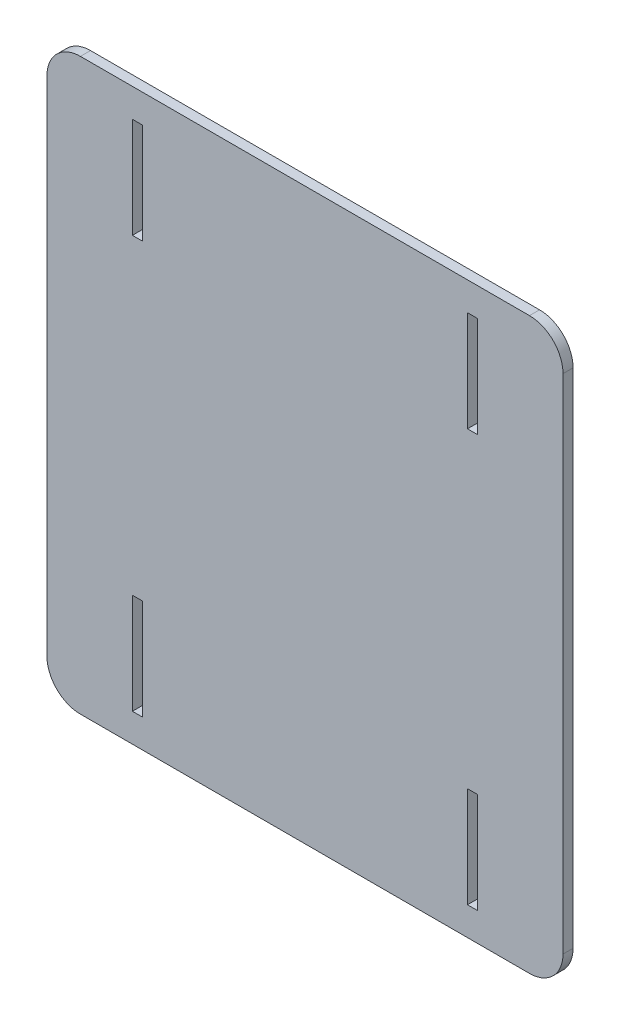
ISO-10303-21;
HEADER;
FILE_DESCRIPTION(('STEP AP214'),'2;1');
FILE_NAME('part.step','',(''),(''),'','','');
FILE_SCHEMA(('AUTOMOTIVE_DESIGN { 1 0 10303 214 1 1 1 1 }'));
ENDSEC;
DATA;
#1=APPLICATION_CONTEXT('core data for automotive mechanical design processes');
#2=APPLICATION_PROTOCOL_DEFINITION('international standard','automotive_design',2000,#1);
#3=PRODUCT_CONTEXT('',#1,'mechanical');
#4=PRODUCT('Part','Part','',(#3));
#5=PRODUCT_RELATED_PRODUCT_CATEGORY('part','',(#4));
#6=PRODUCT_DEFINITION_FORMATION('','',#4);
#7=PRODUCT_DEFINITION_CONTEXT('part definition',#1,'design');
#8=PRODUCT_DEFINITION('design','',#6,#7);
#9=PRODUCT_DEFINITION_SHAPE('','',#8);
#10=(LENGTH_UNIT() NAMED_UNIT(*) SI_UNIT(.MILLI.,.METRE.));
#11=(NAMED_UNIT(*) PLANE_ANGLE_UNIT() SI_UNIT($,.RADIAN.));
#12=(NAMED_UNIT(*) SI_UNIT($,.STERADIAN.) SOLID_ANGLE_UNIT());
#13=UNCERTAINTY_MEASURE_WITH_UNIT(LENGTH_MEASURE(1.E-05),#10,'distance_accuracy_value','');
#14=(GEOMETRIC_REPRESENTATION_CONTEXT(3) GLOBAL_UNCERTAINTY_ASSIGNED_CONTEXT((#13)) GLOBAL_UNIT_ASSIGNED_CONTEXT((#10,
#11,#12)) REPRESENTATION_CONTEXT('',''));
#15=CARTESIAN_POINT('',(0.,0.,0.));
#16=DIRECTION('',(0.,0.,1.));
#17=DIRECTION('',(1.,0.,0.));
#18=AXIS2_PLACEMENT_3D('',#15,#16,#17);
#19=CARTESIAN_POINT('',(0.,0.,3.));
#20=DIRECTION('',(0.,0.,-1.));
#21=DIRECTION('',(-1.,0.,0.));
#22=AXIS2_PLACEMENT_3D('',#19,#20,#21);
#23=PLANE('',#22);
#24=DIRECTION('',(1.,0.,0.));
#25=VECTOR('',#24,1.);
#26=CARTESIAN_POINT('',(0.,-46.5,3.));
#27=LINE('',#26,#25);
#28=CARTESIAN_POINT('',(48.5,-46.5,3.));
#29=VERTEX_POINT('',#28);
#30=CARTESIAN_POINT('',(51.5,-46.5,3.));
#31=VERTEX_POINT('',#30);
#32=EDGE_CURVE('E62',#29,#31,#27,.T.);
#33=ORIENTED_EDGE('',*,*,#32,.T.);
#34=DIRECTION('',(0.,-1.,0.));
#35=VECTOR('',#34,1.);
#36=CARTESIAN_POINT('',(51.5,0.,3.));
#37=LINE('',#36,#35);
#38=CARTESIAN_POINT('',(51.5,-76.5,3.));
#39=VERTEX_POINT('',#38);
#40=EDGE_CURVE('E249',#31,#39,#37,.T.);
#41=ORIENTED_EDGE('',*,*,#40,.T.);
#42=DIRECTION('',(-1.,0.,0.));
#43=VECTOR('',#42,1.);
#44=CARTESIAN_POINT('',(0.,-76.5,3.));
#45=LINE('',#44,#43);
#46=CARTESIAN_POINT('',(48.5,-76.5,3.));
#47=VERTEX_POINT('',#46);
#48=EDGE_CURVE('E263',#39,#47,#45,.T.);
#49=ORIENTED_EDGE('',*,*,#48,.T.);
#50=DIRECTION('',(0.,-1.,0.));
#51=VECTOR('',#50,1.);
#52=CARTESIAN_POINT('',(48.5,0.,3.));
#53=LINE('',#52,#51);
#54=EDGE_CURVE('E259',#29,#47,#53,.T.);
#55=ORIENTED_EDGE('',*,*,#54,.F.);
#56=EDGE_LOOP('',(#33,#41,#49,#55));
#57=FACE_BOUND('',#56,.T.);
#58=DIRECTION('',(1.,0.,0.));
#59=VECTOR('',#58,1.);
#60=CARTESIAN_POINT('',(0.,46.5,3.));
#61=LINE('',#60,#59);
#62=CARTESIAN_POINT('',(48.5,46.5,3.));
#63=VERTEX_POINT('',#62);
#64=CARTESIAN_POINT('',(51.5,46.5,3.));
#65=VERTEX_POINT('',#64);
#66=EDGE_CURVE('E235',#63,#65,#61,.T.);
#67=ORIENTED_EDGE('',*,*,#66,.F.);
#68=DIRECTION('',(0.,-1.,0.));
#69=VECTOR('',#68,1.);
#70=CARTESIAN_POINT('',(48.5,0.,3.));
#71=LINE('',#70,#69);
#72=CARTESIAN_POINT('',(48.5,76.5,3.));
#73=VERTEX_POINT('',#72);
#74=EDGE_CURVE('E208',#73,#63,#71,.T.);
#75=ORIENTED_EDGE('',*,*,#74,.F.);
#76=DIRECTION('',(-1.,0.,0.));
#77=VECTOR('',#76,1.);
#78=CARTESIAN_POINT('',(0.,76.5,3.));
#79=LINE('',#78,#77);
#80=CARTESIAN_POINT('',(51.5,76.5,3.));
#81=VERTEX_POINT('',#80);
#82=EDGE_CURVE('E226',#81,#73,#79,.T.);
#83=ORIENTED_EDGE('',*,*,#82,.F.);
#84=DIRECTION('',(0.,-1.,0.));
#85=VECTOR('',#84,1.);
#86=CARTESIAN_POINT('',(51.5,0.,3.));
#87=LINE('',#86,#85);
#88=EDGE_CURVE('E229',#81,#65,#87,.T.);
#89=ORIENTED_EDGE('',*,*,#88,.T.);
#90=EDGE_LOOP('',(#67,#75,#83,#89));
#91=FACE_BOUND('',#90,.T.);
#92=DIRECTION('',(0.,1.,0.));
#93=VECTOR('',#92,1.);
#94=CARTESIAN_POINT('',(77.,-85.,3.));
#95=LINE('',#94,#93);
#96=CARTESIAN_POINT('',(77.,-75.,3.));
#97=VERTEX_POINT('',#96);
#98=CARTESIAN_POINT('',(77.,75.,3.));
#99=VERTEX_POINT('',#98);
#100=EDGE_CURVE('E332',#97,#99,#95,.T.);
#101=ORIENTED_EDGE('',*,*,#100,.T.);
#102=CARTESIAN_POINT('',(67.,75.,3.));
#103=DIRECTION('',(0.,0.,-1.));
#104=DIRECTION('',(-1.,0.,0.));
#105=AXIS2_PLACEMENT_3D('',#102,#103,#104);
#106=CIRCLE('',#105,10.);
#107=CARTESIAN_POINT('',(67.,85.,3.));
#108=VERTEX_POINT('',#107);
#109=EDGE_CURVE('E379',#99,#108,#106,.F.);
#110=ORIENTED_EDGE('',*,*,#109,.T.);
#111=DIRECTION('',(-1.,0.,0.));
#112=VECTOR('',#111,1.);
#113=CARTESIAN_POINT('',(-77.,85.,3.));
#114=LINE('',#113,#112);
#115=CARTESIAN_POINT('',(-67.,85.,3.));
#116=VERTEX_POINT('',#115);
#117=EDGE_CURVE('E335',#108,#116,#114,.T.);
#118=ORIENTED_EDGE('',*,*,#117,.T.);
#119=CARTESIAN_POINT('',(-67.,75.,3.));
#120=DIRECTION('',(0.,0.,-1.));
#121=DIRECTION('',(-1.,0.,0.));
#122=AXIS2_PLACEMENT_3D('',#119,#120,#121);
#123=CIRCLE('',#122,10.);
#124=CARTESIAN_POINT('',(-77.,75.,3.));
#125=VERTEX_POINT('',#124);
#126=EDGE_CURVE('E373',#116,#125,#123,.F.);
#127=ORIENTED_EDGE('',*,*,#126,.T.);
#128=DIRECTION('',(0.,-1.,0.));
#129=VECTOR('',#128,1.);
#130=CARTESIAN_POINT('',(-77.,-85.,3.));
#131=LINE('',#130,#129);
#132=CARTESIAN_POINT('',(-77.,-75.,3.));
#133=VERTEX_POINT('',#132);
#134=EDGE_CURVE('E339',#125,#133,#131,.T.);
#135=ORIENTED_EDGE('',*,*,#134,.T.);
#136=CARTESIAN_POINT('',(-67.,-75.,3.));
#137=DIRECTION('',(0.,0.,-1.));
#138=DIRECTION('',(-1.,0.,0.));
#139=AXIS2_PLACEMENT_3D('',#136,#137,#138);
#140=CIRCLE('',#139,10.);
#141=CARTESIAN_POINT('',(-67.,-85.,3.));
#142=VERTEX_POINT('',#141);
#143=EDGE_CURVE('E375',#133,#142,#140,.F.);
#144=ORIENTED_EDGE('',*,*,#143,.T.);
#145=DIRECTION('',(1.,0.,0.));
#146=VECTOR('',#145,1.);
#147=CARTESIAN_POINT('',(-77.,-85.,3.));
#148=LINE('',#147,#146);
#149=CARTESIAN_POINT('',(67.,-85.,3.));
#150=VERTEX_POINT('',#149);
#151=EDGE_CURVE('E342',#142,#150,#148,.T.);
#152=ORIENTED_EDGE('',*,*,#151,.T.);
#153=CARTESIAN_POINT('',(67.,-75.,3.));
#154=DIRECTION('',(0.,0.,-1.));
#155=DIRECTION('',(-1.,0.,0.));
#156=AXIS2_PLACEMENT_3D('',#153,#154,#155);
#157=CIRCLE('',#156,10.);
#158=EDGE_CURVE('E377',#150,#97,#157,.F.);
#159=ORIENTED_EDGE('',*,*,#158,.T.);
#160=EDGE_LOOP('',(#101,#110,#118,#127,#135,#144,#152,#159));
#161=FACE_BOUND('',#160,.T.);
#162=DIRECTION('',(0.,-1.,0.));
#163=VECTOR('',#162,1.);
#164=CARTESIAN_POINT('',(-48.5,0.,3.));
#165=LINE('',#164,#163);
#166=CARTESIAN_POINT('',(-48.5,76.5,3.));
#167=VERTEX_POINT('',#166);
#168=CARTESIAN_POINT('',(-48.5,46.5,3.));
#169=VERTEX_POINT('',#168);
#170=EDGE_CURVE('E242',#167,#169,#165,.T.);
#171=ORIENTED_EDGE('',*,*,#170,.T.);
#172=DIRECTION('',(1.,0.,0.));
#173=VECTOR('',#172,1.);
#174=CARTESIAN_POINT('',(0.,46.5,3.));
#175=LINE('',#174,#173);
#176=CARTESIAN_POINT('',(-51.5,46.5,3.));
#177=VERTEX_POINT('',#176);
#178=EDGE_CURVE('E304',#177,#169,#175,.T.);
#179=ORIENTED_EDGE('',*,*,#178,.F.);
#180=DIRECTION('',(0.,-1.,0.));
#181=VECTOR('',#180,1.);
#182=CARTESIAN_POINT('',(-51.5,0.,3.));
#183=LINE('',#182,#181);
#184=CARTESIAN_POINT('',(-51.5,76.5,3.));
#185=VERTEX_POINT('',#184);
#186=EDGE_CURVE('E318',#185,#177,#183,.T.);
#187=ORIENTED_EDGE('',*,*,#186,.F.);
#188=DIRECTION('',(1.,0.,0.));
#189=VECTOR('',#188,1.);
#190=CARTESIAN_POINT('',(0.,76.5,3.));
#191=LINE('',#190,#189);
#192=EDGE_CURVE('E315',#185,#167,#191,.T.);
#193=ORIENTED_EDGE('',*,*,#192,.T.);
#194=EDGE_LOOP('',(#171,#179,#187,#193));
#195=FACE_BOUND('',#194,.T.);
#196=DIRECTION('',(1.,0.,0.));
#197=VECTOR('',#196,1.);
#198=CARTESIAN_POINT('',(0.,-46.5,3.));
#199=LINE('',#198,#197);
#200=CARTESIAN_POINT('',(-51.5,-46.5,3.));
#201=VERTEX_POINT('',#200);
#202=CARTESIAN_POINT('',(-48.5,-46.5,3.));
#203=VERTEX_POINT('',#202);
#204=EDGE_CURVE('E54',#201,#203,#199,.T.);
#205=ORIENTED_EDGE('',*,*,#204,.T.);
#206=DIRECTION('',(0.,-1.,0.));
#207=VECTOR('',#206,1.);
#208=CARTESIAN_POINT('',(-48.5,0.,3.));
#209=LINE('',#208,#207);
#210=CARTESIAN_POINT('',(-48.5,-76.5,3.));
#211=VERTEX_POINT('',#210);
#212=EDGE_CURVE('E277',#203,#211,#209,.T.);
#213=ORIENTED_EDGE('',*,*,#212,.T.);
#214=DIRECTION('',(1.,0.,0.));
#215=VECTOR('',#214,1.);
#216=CARTESIAN_POINT('',(0.,-76.5,3.));
#217=LINE('',#216,#215);
#218=CARTESIAN_POINT('',(-51.5,-76.5,3.));
#219=VERTEX_POINT('',#218);
#220=EDGE_CURVE('E290',#219,#211,#217,.T.);
#221=ORIENTED_EDGE('',*,*,#220,.F.);
#222=DIRECTION('',(0.,-1.,0.));
#223=VECTOR('',#222,1.);
#224=CARTESIAN_POINT('',(-51.5,0.,3.));
#225=LINE('',#224,#223);
#226=EDGE_CURVE('E287',#201,#219,#225,.T.);
#227=ORIENTED_EDGE('',*,*,#226,.F.);
#228=EDGE_LOOP('',(#205,#213,#221,#227));
#229=FACE_BOUND('',#228,.T.);
#230=ADVANCED_FACE('F39',(#57,#91,#161,#195,#229),#23,.F.);
#231=CARTESIAN_POINT('',(0.,0.,0.));
#232=DIRECTION('',(0.,0.,-1.));
#233=DIRECTION('',(-1.,0.,0.));
#234=AXIS2_PLACEMENT_3D('',#231,#232,#233);
#235=PLANE('',#234);
#236=DIRECTION('',(0.,-1.,0.));
#237=VECTOR('',#236,1.);
#238=CARTESIAN_POINT('',(48.5,0.,0.));
#239=LINE('',#238,#237);
#240=CARTESIAN_POINT('',(48.5,76.5,0.));
#241=VERTEX_POINT('',#240);
#242=CARTESIAN_POINT('',(48.5,46.5,0.));
#243=VERTEX_POINT('',#242);
#244=EDGE_CURVE('E205',#241,#243,#239,.T.);
#245=ORIENTED_EDGE('',*,*,#244,.T.);
#246=DIRECTION('',(1.,0.,0.));
#247=VECTOR('',#246,1.);
#248=CARTESIAN_POINT('',(0.,46.5,0.));
#249=LINE('',#248,#247);
#250=CARTESIAN_POINT('',(51.5,46.5,0.));
#251=VERTEX_POINT('',#250);
#252=EDGE_CURVE('E216',#243,#251,#249,.T.);
#253=ORIENTED_EDGE('',*,*,#252,.T.);
#254=DIRECTION('',(0.,-1.,0.));
#255=VECTOR('',#254,1.);
#256=CARTESIAN_POINT('',(51.5,0.,0.));
#257=LINE('',#256,#255);
#258=CARTESIAN_POINT('',(51.5,76.5,0.));
#259=VERTEX_POINT('',#258);
#260=EDGE_CURVE('E221',#259,#251,#257,.T.);
#261=ORIENTED_EDGE('',*,*,#260,.F.);
#262=DIRECTION('',(-1.,0.,0.));
#263=VECTOR('',#262,1.);
#264=CARTESIAN_POINT('',(0.,76.5,0.));
#265=LINE('',#264,#263);
#266=EDGE_CURVE('E213',#259,#241,#265,.T.);
#267=ORIENTED_EDGE('',*,*,#266,.T.);
#268=EDGE_LOOP('',(#245,#253,#261,#267));
#269=FACE_BOUND('',#268,.T.);
#270=DIRECTION('',(-1.,0.,0.));
#271=VECTOR('',#270,1.);
#272=CARTESIAN_POINT('',(-77.,85.,0.));
#273=LINE('',#272,#271);
#274=CARTESIAN_POINT('',(67.,85.,0.));
#275=VERTEX_POINT('',#274);
#276=CARTESIAN_POINT('',(-67.,85.,0.));
#277=VERTEX_POINT('',#276);
#278=EDGE_CURVE('E348',#275,#277,#273,.T.);
#279=ORIENTED_EDGE('',*,*,#278,.F.);
#280=CARTESIAN_POINT('',(67.,75.,0.));
#281=DIRECTION('',(0.,0.,-1.));
#282=DIRECTION('',(-1.,0.,0.));
#283=AXIS2_PLACEMENT_3D('',#280,#281,#282);
#284=CIRCLE('',#283,10.);
#285=CARTESIAN_POINT('',(77.,75.,0.));
#286=VERTEX_POINT('',#285);
#287=EDGE_CURVE('E366',#275,#286,#284,.T.);
#288=ORIENTED_EDGE('',*,*,#287,.T.);
#289=DIRECTION('',(0.,1.,0.));
#290=VECTOR('',#289,1.);
#291=CARTESIAN_POINT('',(77.,-85.,0.));
#292=LINE('',#291,#290);
#293=CARTESIAN_POINT('',(77.,-75.,0.));
#294=VERTEX_POINT('',#293);
#295=EDGE_CURVE('E325',#294,#286,#292,.T.);
#296=ORIENTED_EDGE('',*,*,#295,.F.);
#297=CARTESIAN_POINT('',(67.,-75.,0.));
#298=DIRECTION('',(0.,0.,-1.));
#299=DIRECTION('',(-1.,0.,0.));
#300=AXIS2_PLACEMENT_3D('',#297,#298,#299);
#301=CIRCLE('',#300,10.);
#302=CARTESIAN_POINT('',(67.,-85.,0.));
#303=VERTEX_POINT('',#302);
#304=EDGE_CURVE('E364',#294,#303,#301,.T.);
#305=ORIENTED_EDGE('',*,*,#304,.T.);
#306=DIRECTION('',(1.,0.,0.));
#307=VECTOR('',#306,1.);
#308=CARTESIAN_POINT('',(-77.,-85.,0.));
#309=LINE('',#308,#307);
#310=CARTESIAN_POINT('',(-67.,-85.,0.));
#311=VERTEX_POINT('',#310);
#312=EDGE_CURVE('E336',#311,#303,#309,.T.);
#313=ORIENTED_EDGE('',*,*,#312,.F.);
#314=CARTESIAN_POINT('',(-67.,-75.,0.));
#315=DIRECTION('',(0.,0.,-1.));
#316=DIRECTION('',(-1.,0.,0.));
#317=AXIS2_PLACEMENT_3D('',#314,#315,#316);
#318=CIRCLE('',#317,10.);
#319=CARTESIAN_POINT('',(-77.,-75.,0.));
#320=VERTEX_POINT('',#319);
#321=EDGE_CURVE('E362',#311,#320,#318,.T.);
#322=ORIENTED_EDGE('',*,*,#321,.T.);
#323=DIRECTION('',(0.,-1.,0.));
#324=VECTOR('',#323,1.);
#325=CARTESIAN_POINT('',(-77.,-85.,0.));
#326=LINE('',#325,#324);
#327=CARTESIAN_POINT('',(-77.,75.,0.));
#328=VERTEX_POINT('',#327);
#329=EDGE_CURVE('E351',#328,#320,#326,.T.);
#330=ORIENTED_EDGE('',*,*,#329,.F.);
#331=CARTESIAN_POINT('',(-67.,75.,0.));
#332=DIRECTION('',(0.,0.,-1.));
#333=DIRECTION('',(-1.,0.,0.));
#334=AXIS2_PLACEMENT_3D('',#331,#332,#333);
#335=CIRCLE('',#334,10.);
#336=EDGE_CURVE('E360',#328,#277,#335,.T.);
#337=ORIENTED_EDGE('',*,*,#336,.T.);
#338=EDGE_LOOP('',(#279,#288,#296,#305,#313,#322,#330,#337));
#339=FACE_BOUND('',#338,.T.);
#340=DIRECTION('',(1.,0.,0.));
#341=VECTOR('',#340,1.);
#342=CARTESIAN_POINT('',(0.,46.5,0.));
#343=LINE('',#342,#341);
#344=CARTESIAN_POINT('',(-51.5,46.5,0.));
#345=VERTEX_POINT('',#344);
#346=CARTESIAN_POINT('',(-48.5,46.5,0.));
#347=VERTEX_POINT('',#346);
#348=EDGE_CURVE('E309',#345,#347,#343,.T.);
#349=ORIENTED_EDGE('',*,*,#348,.T.);
#350=DIRECTION('',(0.,-1.,0.));
#351=VECTOR('',#350,1.);
#352=CARTESIAN_POINT('',(-48.5,0.,0.));
#353=LINE('',#352,#351);
#354=CARTESIAN_POINT('',(-48.5,76.5,0.));
#355=VERTEX_POINT('',#354);
#356=EDGE_CURVE('E301',#355,#347,#353,.T.);
#357=ORIENTED_EDGE('',*,*,#356,.F.);
#358=DIRECTION('',(1.,0.,0.));
#359=VECTOR('',#358,1.);
#360=CARTESIAN_POINT('',(0.,76.5,0.));
#361=LINE('',#360,#359);
#362=CARTESIAN_POINT('',(-51.5,76.5,0.));
#363=VERTEX_POINT('',#362);
#364=EDGE_CURVE('E303',#363,#355,#361,.T.);
#365=ORIENTED_EDGE('',*,*,#364,.F.);
#366=DIRECTION('',(0.,-1.,0.));
#367=VECTOR('',#366,1.);
#368=CARTESIAN_POINT('',(-51.5,0.,0.));
#369=LINE('',#368,#367);
#370=EDGE_CURVE('E306',#363,#345,#369,.T.);
#371=ORIENTED_EDGE('',*,*,#370,.T.);
#372=EDGE_LOOP('',(#349,#357,#365,#371));
#373=FACE_BOUND('',#372,.T.);
#374=DIRECTION('',(0.,-1.,0.));
#375=VECTOR('',#374,1.);
#376=CARTESIAN_POINT('',(51.5,0.,0.));
#377=LINE('',#376,#375);
#378=CARTESIAN_POINT('',(51.5,-46.5,0.));
#379=VERTEX_POINT('',#378);
#380=CARTESIAN_POINT('',(51.5,-76.5,0.));
#381=VERTEX_POINT('',#380);
#382=EDGE_CURVE('E255',#379,#381,#377,.T.);
#383=ORIENTED_EDGE('',*,*,#382,.F.);
#384=DIRECTION('',(1.,0.,0.));
#385=VECTOR('',#384,1.);
#386=CARTESIAN_POINT('',(0.,-46.5,0.));
#387=LINE('',#386,#385);
#388=CARTESIAN_POINT('',(48.5,-46.5,0.));
#389=VERTEX_POINT('',#388);
#390=EDGE_CURVE('E246',#389,#379,#387,.T.);
#391=ORIENTED_EDGE('',*,*,#390,.F.);
#392=DIRECTION('',(0.,-1.,0.));
#393=VECTOR('',#392,1.);
#394=CARTESIAN_POINT('',(48.5,0.,0.));
#395=LINE('',#394,#393);
#396=CARTESIAN_POINT('',(48.5,-76.5,0.));
#397=VERTEX_POINT('',#396);
#398=EDGE_CURVE('E248',#389,#397,#395,.T.);
#399=ORIENTED_EDGE('',*,*,#398,.T.);
#400=DIRECTION('',(-1.,0.,0.));
#401=VECTOR('',#400,1.);
#402=CARTESIAN_POINT('',(0.,-76.5,0.));
#403=LINE('',#402,#401);
#404=EDGE_CURVE('E252',#381,#397,#403,.T.);
#405=ORIENTED_EDGE('',*,*,#404,.F.);
#406=EDGE_LOOP('',(#383,#391,#399,#405));
#407=FACE_BOUND('',#406,.T.);
#408=DIRECTION('',(0.,-1.,0.));
#409=VECTOR('',#408,1.);
#410=CARTESIAN_POINT('',(-48.5,0.,0.));
#411=LINE('',#410,#409);
#412=CARTESIAN_POINT('',(-48.5,-46.5,0.));
#413=VERTEX_POINT('',#412);
#414=CARTESIAN_POINT('',(-48.5,-76.5,0.));
#415=VERTEX_POINT('',#414);
#416=EDGE_CURVE('E283',#413,#415,#411,.T.);
#417=ORIENTED_EDGE('',*,*,#416,.F.);
#418=DIRECTION('',(1.,0.,0.));
#419=VECTOR('',#418,1.);
#420=CARTESIAN_POINT('',(0.,-46.5,0.));
#421=LINE('',#420,#419);
#422=CARTESIAN_POINT('',(-51.5,-46.5,0.));
#423=VERTEX_POINT('',#422);
#424=EDGE_CURVE('E274',#423,#413,#421,.T.);
#425=ORIENTED_EDGE('',*,*,#424,.F.);
#426=DIRECTION('',(0.,-1.,0.));
#427=VECTOR('',#426,1.);
#428=CARTESIAN_POINT('',(-51.5,0.,0.));
#429=LINE('',#428,#427);
#430=CARTESIAN_POINT('',(-51.5,-76.5,0.));
#431=VERTEX_POINT('',#430);
#432=EDGE_CURVE('E276',#423,#431,#429,.T.);
#433=ORIENTED_EDGE('',*,*,#432,.T.);
#434=DIRECTION('',(1.,0.,0.));
#435=VECTOR('',#434,1.);
#436=CARTESIAN_POINT('',(0.,-76.5,0.));
#437=LINE('',#436,#435);
#438=EDGE_CURVE('E280',#431,#415,#437,.T.);
#439=ORIENTED_EDGE('',*,*,#438,.T.);
#440=EDGE_LOOP('',(#417,#425,#433,#439));
#441=FACE_BOUND('',#440,.T.);
#442=ADVANCED_FACE('F223',(#269,#339,#373,#407,#441),#235,.T.);
#443=CARTESIAN_POINT('',(77.,-85.,3.));
#444=DIRECTION('',(-1.,0.,0.));
#445=DIRECTION('',(0.,0.,1.));
#446=AXIS2_PLACEMENT_3D('',#443,#444,#445);
#447=PLANE('',#446);
#448=ORIENTED_EDGE('',*,*,#295,.T.);
#449=DIRECTION('',(0.,0.,-1.));
#450=VECTOR('',#449,1.);
#451=CARTESIAN_POINT('',(77.,75.,3.));
#452=LINE('',#451,#450);
#453=EDGE_CURVE('E371',#286,#99,#452,.F.);
#454=ORIENTED_EDGE('',*,*,#453,.T.);
#455=ORIENTED_EDGE('',*,*,#100,.F.);
#456=DIRECTION('',(0.,0.,-1.));
#457=VECTOR('',#456,1.);
#458=CARTESIAN_POINT('',(77.,-75.,3.));
#459=LINE('',#458,#457);
#460=EDGE_CURVE('E368',#97,#294,#459,.T.);
#461=ORIENTED_EDGE('',*,*,#460,.T.);
#462=EDGE_LOOP('',(#448,#454,#455,#461));
#463=FACE_BOUND('',#462,.T.);
#464=ADVANCED_FACE('F414',(#463),#447,.F.);
#465=CARTESIAN_POINT('',(-77.,85.,3.));
#466=DIRECTION('',(0.,-1.,0.));
#467=DIRECTION('',(0.,0.,-1.));
#468=AXIS2_PLACEMENT_3D('',#465,#466,#467);
#469=PLANE('',#468);
#470=ORIENTED_EDGE('',*,*,#117,.F.);
#471=DIRECTION('',(0.,0.,-1.));
#472=VECTOR('',#471,1.);
#473=CARTESIAN_POINT('',(67.,85.,3.));
#474=LINE('',#473,#472);
#475=EDGE_CURVE('E357',#108,#275,#474,.T.);
#476=ORIENTED_EDGE('',*,*,#475,.T.);
#477=ORIENTED_EDGE('',*,*,#278,.T.);
#478=DIRECTION('',(0.,0.,-1.));
#479=VECTOR('',#478,1.);
#480=CARTESIAN_POINT('',(-67.,85.,3.));
#481=LINE('',#480,#479);
#482=EDGE_CURVE('E345',#277,#116,#481,.F.);
#483=ORIENTED_EDGE('',*,*,#482,.T.);
#484=EDGE_LOOP('',(#470,#476,#477,#483));
#485=FACE_BOUND('',#484,.T.);
#486=ADVANCED_FACE('F422',(#485),#469,.F.);
#487=CARTESIAN_POINT('',(-77.,-85.,3.));
#488=DIRECTION('',(1.,0.,0.));
#489=DIRECTION('',(0.,0.,-1.));
#490=AXIS2_PLACEMENT_3D('',#487,#488,#489);
#491=PLANE('',#490);
#492=ORIENTED_EDGE('',*,*,#329,.T.);
#493=DIRECTION('',(0.,0.,-1.));
#494=VECTOR('',#493,1.);
#495=CARTESIAN_POINT('',(-77.,-75.,3.));
#496=LINE('',#495,#494);
#497=EDGE_CURVE('E11',#320,#133,#496,.F.);
#498=ORIENTED_EDGE('',*,*,#497,.T.);
#499=ORIENTED_EDGE('',*,*,#134,.F.);
#500=DIRECTION('',(0.,0.,-1.));
#501=VECTOR('',#500,1.);
#502=CARTESIAN_POINT('',(-77.,75.,3.));
#503=LINE('',#502,#501);
#504=EDGE_CURVE('E47',#125,#328,#503,.T.);
#505=ORIENTED_EDGE('',*,*,#504,.T.);
#506=EDGE_LOOP('',(#492,#498,#499,#505));
#507=FACE_BOUND('',#506,.T.);
#508=ADVANCED_FACE('F390',(#507),#491,.F.);
#509=CARTESIAN_POINT('',(-77.,-85.,3.));
#510=DIRECTION('',(0.,1.,0.));
#511=DIRECTION('',(0.,0.,1.));
#512=AXIS2_PLACEMENT_3D('',#509,#510,#511);
#513=PLANE('',#512);
#514=ORIENTED_EDGE('',*,*,#312,.T.);
#515=DIRECTION('',(0.,0.,-1.));
#516=VECTOR('',#515,1.);
#517=CARTESIAN_POINT('',(67.,-85.,3.));
#518=LINE('',#517,#516);
#519=EDGE_CURVE('E384',#303,#150,#518,.F.);
#520=ORIENTED_EDGE('',*,*,#519,.T.);
#521=ORIENTED_EDGE('',*,*,#151,.F.);
#522=DIRECTION('',(0.,0.,-1.));
#523=VECTOR('',#522,1.);
#524=CARTESIAN_POINT('',(-67.,-85.,3.));
#525=LINE('',#524,#523);
#526=EDGE_CURVE('E381',#142,#311,#525,.T.);
#527=ORIENTED_EDGE('',*,*,#526,.T.);
#528=EDGE_LOOP('',(#514,#520,#521,#527));
#529=FACE_BOUND('',#528,.T.);
#530=ADVANCED_FACE('F403',(#529),#513,.F.);
#531=CARTESIAN_POINT('',(67.,75.,3.));
#532=DIRECTION('',(0.,0.,-1.));
#533=DIRECTION('',(-1.,0.,0.));
#534=AXIS2_PLACEMENT_3D('',#531,#532,#533);
#535=CYLINDRICAL_SURFACE('',#534,10.);
#536=ORIENTED_EDGE('',*,*,#109,.F.);
#537=ORIENTED_EDGE('',*,*,#453,.F.);
#538=ORIENTED_EDGE('',*,*,#287,.F.);
#539=ORIENTED_EDGE('',*,*,#475,.F.);
#540=EDGE_LOOP('',(#536,#537,#538,#539));
#541=FACE_BOUND('',#540,.T.);
#542=ADVANCED_FACE('F419',(#541),#535,.T.);
#543=CARTESIAN_POINT('',(67.,-75.,3.));
#544=DIRECTION('',(0.,0.,-1.));
#545=DIRECTION('',(-1.,0.,0.));
#546=AXIS2_PLACEMENT_3D('',#543,#544,#545);
#547=CYLINDRICAL_SURFACE('',#546,10.);
#548=ORIENTED_EDGE('',*,*,#158,.F.);
#549=ORIENTED_EDGE('',*,*,#519,.F.);
#550=ORIENTED_EDGE('',*,*,#304,.F.);
#551=ORIENTED_EDGE('',*,*,#460,.F.);
#552=EDGE_LOOP('',(#548,#549,#550,#551));
#553=FACE_BOUND('',#552,.T.);
#554=ADVANCED_FACE('F411',(#553),#547,.T.);
#555=CARTESIAN_POINT('',(-67.,-75.,3.));
#556=DIRECTION('',(0.,0.,-1.));
#557=DIRECTION('',(-1.,0.,0.));
#558=AXIS2_PLACEMENT_3D('',#555,#556,#557);
#559=CYLINDRICAL_SURFACE('',#558,10.);
#560=ORIENTED_EDGE('',*,*,#143,.F.);
#561=ORIENTED_EDGE('',*,*,#497,.F.);
#562=ORIENTED_EDGE('',*,*,#321,.F.);
#563=ORIENTED_EDGE('',*,*,#526,.F.);
#564=EDGE_LOOP('',(#560,#561,#562,#563));
#565=FACE_BOUND('',#564,.T.);
#566=ADVANCED_FACE('F400',(#565),#559,.T.);
#567=CARTESIAN_POINT('',(-67.,75.,3.));
#568=DIRECTION('',(0.,0.,-1.));
#569=DIRECTION('',(-1.,0.,0.));
#570=AXIS2_PLACEMENT_3D('',#567,#568,#569);
#571=CYLINDRICAL_SURFACE('',#570,10.);
#572=ORIENTED_EDGE('',*,*,#126,.F.);
#573=ORIENTED_EDGE('',*,*,#482,.F.);
#574=ORIENTED_EDGE('',*,*,#336,.F.);
#575=ORIENTED_EDGE('',*,*,#504,.F.);
#576=EDGE_LOOP('',(#572,#573,#574,#575));
#577=FACE_BOUND('',#576,.T.);
#578=ADVANCED_FACE('F41',(#577),#571,.T.);
#579=CARTESIAN_POINT('',(-48.5,0.,0.));
#580=DIRECTION('',(-1.,0.,0.));
#581=DIRECTION('',(0.,-1.,0.));
#582=AXIS2_PLACEMENT_3D('',#579,#580,#581);
#583=PLANE('',#582);
#584=ORIENTED_EDGE('',*,*,#170,.F.);
#585=DIRECTION('',(0.,0.,1.));
#586=VECTOR('',#585,1.);
#587=CARTESIAN_POINT('',(-48.5,76.5,0.));
#588=LINE('',#587,#586);
#589=EDGE_CURVE('E312',#355,#167,#588,.T.);
#590=ORIENTED_EDGE('',*,*,#589,.F.);
#591=ORIENTED_EDGE('',*,*,#356,.T.);
#592=DIRECTION('',(0.,0.,1.));
#593=VECTOR('',#592,1.);
#594=CARTESIAN_POINT('',(-48.5,46.5,0.));
#595=LINE('',#594,#593);
#596=EDGE_CURVE('E323',#347,#169,#595,.T.);
#597=ORIENTED_EDGE('',*,*,#596,.T.);
#598=EDGE_LOOP('',(#584,#590,#591,#597));
#599=FACE_BOUND('',#598,.T.);
#600=ADVANCED_FACE('F425',(#599),#583,.T.);
#601=CARTESIAN_POINT('',(0.,46.5,0.));
#602=DIRECTION('',(0.,-1.,0.));
#603=DIRECTION('',(0.,0.,-1.));
#604=AXIS2_PLACEMENT_3D('',#601,#602,#603);
#605=PLANE('',#604);
#606=ORIENTED_EDGE('',*,*,#178,.T.);
#607=ORIENTED_EDGE('',*,*,#596,.F.);
#608=ORIENTED_EDGE('',*,*,#348,.F.);
#609=DIRECTION('',(0.,0.,1.));
#610=VECTOR('',#609,1.);
#611=CARTESIAN_POINT('',(-51.5,46.5,0.));
#612=LINE('',#611,#610);
#613=EDGE_CURVE('E326',#345,#177,#612,.T.);
#614=ORIENTED_EDGE('',*,*,#613,.T.);
#615=EDGE_LOOP('',(#606,#607,#608,#614));
#616=FACE_BOUND('',#615,.T.);
#617=ADVANCED_FACE('F431',(#616),#605,.F.);
#618=CARTESIAN_POINT('',(-51.5,0.,0.));
#619=DIRECTION('',(-1.,0.,0.));
#620=DIRECTION('',(0.,0.,1.));
#621=AXIS2_PLACEMENT_3D('',#618,#619,#620);
#622=PLANE('',#621);
#623=ORIENTED_EDGE('',*,*,#186,.T.);
#624=ORIENTED_EDGE('',*,*,#613,.F.);
#625=ORIENTED_EDGE('',*,*,#370,.F.);
#626=DIRECTION('',(0.,0.,1.));
#627=VECTOR('',#626,1.);
#628=CARTESIAN_POINT('',(-51.5,76.5,0.));
#629=LINE('',#628,#627);
#630=EDGE_CURVE('E328',#363,#185,#629,.T.);
#631=ORIENTED_EDGE('',*,*,#630,.T.);
#632=EDGE_LOOP('',(#623,#624,#625,#631));
#633=FACE_BOUND('',#632,.T.);
#634=ADVANCED_FACE('F492',(#633),#622,.F.);
#635=CARTESIAN_POINT('',(0.,76.5,0.));
#636=DIRECTION('',(0.,-1.,0.));
#637=DIRECTION('',(0.,0.,-1.));
#638=AXIS2_PLACEMENT_3D('',#635,#636,#637);
#639=PLANE('',#638);
#640=ORIENTED_EDGE('',*,*,#192,.F.);
#641=ORIENTED_EDGE('',*,*,#630,.F.);
#642=ORIENTED_EDGE('',*,*,#364,.T.);
#643=ORIENTED_EDGE('',*,*,#589,.T.);
#644=EDGE_LOOP('',(#640,#641,#642,#643));
#645=FACE_BOUND('',#644,.T.);
#646=ADVANCED_FACE('F502',(#645),#639,.T.);
#647=CARTESIAN_POINT('',(48.5,0.,0.));
#648=DIRECTION('',(-1.,0.,0.));
#649=DIRECTION('',(0.,-1.,0.));
#650=AXIS2_PLACEMENT_3D('',#647,#648,#649);
#651=PLANE('',#650);
#652=ORIENTED_EDGE('',*,*,#74,.T.);
#653=DIRECTION('',(0.,0.,1.));
#654=VECTOR('',#653,1.);
#655=CARTESIAN_POINT('',(48.5,46.5,0.));
#656=LINE('',#655,#654);
#657=EDGE_CURVE('E201',#243,#63,#656,.T.);
#658=ORIENTED_EDGE('',*,*,#657,.F.);
#659=ORIENTED_EDGE('',*,*,#244,.F.);
#660=DIRECTION('',(0.,0.,1.));
#661=VECTOR('',#660,1.);
#662=CARTESIAN_POINT('',(48.5,76.5,0.));
#663=LINE('',#662,#661);
#664=EDGE_CURVE('E240',#241,#73,#663,.T.);
#665=ORIENTED_EDGE('',*,*,#664,.T.);
#666=EDGE_LOOP('',(#652,#658,#659,#665));
#667=FACE_BOUND('',#666,.T.);
#668=ADVANCED_FACE('F203',(#667),#651,.F.);
#669=CARTESIAN_POINT('',(0.,76.5,0.));
#670=DIRECTION('',(0.,1.,0.));
#671=DIRECTION('',(0.,0.,1.));
#672=AXIS2_PLACEMENT_3D('',#669,#670,#671);
#673=PLANE('',#672);
#674=ORIENTED_EDGE('',*,*,#82,.T.);
#675=ORIENTED_EDGE('',*,*,#664,.F.);
#676=ORIENTED_EDGE('',*,*,#266,.F.);
#677=DIRECTION('',(0.,0.,1.));
#678=VECTOR('',#677,1.);
#679=CARTESIAN_POINT('',(51.5,76.5,0.));
#680=LINE('',#679,#678);
#681=EDGE_CURVE('E243',#259,#81,#680,.T.);
#682=ORIENTED_EDGE('',*,*,#681,.T.);
#683=EDGE_LOOP('',(#674,#675,#676,#682));
#684=FACE_BOUND('',#683,.T.);
#685=ADVANCED_FACE('F520',(#684),#673,.F.);
#686=CARTESIAN_POINT('',(51.5,0.,0.));
#687=DIRECTION('',(-1.,0.,0.));
#688=DIRECTION('',(0.,0.,1.));
#689=AXIS2_PLACEMENT_3D('',#686,#687,#688);
#690=PLANE('',#689);
#691=ORIENTED_EDGE('',*,*,#88,.F.);
#692=ORIENTED_EDGE('',*,*,#681,.F.);
#693=ORIENTED_EDGE('',*,*,#260,.T.);
#694=DIRECTION('',(0.,0.,1.));
#695=VECTOR('',#694,1.);
#696=CARTESIAN_POINT('',(51.5,46.5,0.));
#697=LINE('',#696,#695);
#698=EDGE_CURVE('E212',#251,#65,#697,.T.);
#699=ORIENTED_EDGE('',*,*,#698,.T.);
#700=EDGE_LOOP('',(#691,#692,#693,#699));
#701=FACE_BOUND('',#700,.T.);
#702=ADVANCED_FACE('F529',(#701),#690,.T.);
#703=CARTESIAN_POINT('',(0.,46.5,0.));
#704=DIRECTION('',(0.,-1.,0.));
#705=DIRECTION('',(0.,0.,-1.));
#706=AXIS2_PLACEMENT_3D('',#703,#704,#705);
#707=PLANE('',#706);
#708=ORIENTED_EDGE('',*,*,#66,.T.);
#709=ORIENTED_EDGE('',*,*,#698,.F.);
#710=ORIENTED_EDGE('',*,*,#252,.F.);
#711=ORIENTED_EDGE('',*,*,#657,.T.);
#712=EDGE_LOOP('',(#708,#709,#710,#711));
#713=FACE_BOUND('',#712,.T.);
#714=ADVANCED_FACE('F217',(#713),#707,.F.);
#715=CARTESIAN_POINT('',(0.,-46.5,0.));
#716=DIRECTION('',(0.,-1.,0.));
#717=DIRECTION('',(0.,0.,-1.));
#718=AXIS2_PLACEMENT_3D('',#715,#716,#717);
#719=PLANE('',#718);
#720=ORIENTED_EDGE('',*,*,#32,.F.);
#721=DIRECTION('',(0.,0.,1.));
#722=VECTOR('',#721,1.);
#723=CARTESIAN_POINT('',(48.5,-46.5,0.));
#724=LINE('',#723,#722);
#725=EDGE_CURVE('E257',#389,#29,#724,.T.);
#726=ORIENTED_EDGE('',*,*,#725,.F.);
#727=ORIENTED_EDGE('',*,*,#390,.T.);
#728=DIRECTION('',(0.,0.,1.));
#729=VECTOR('',#728,1.);
#730=CARTESIAN_POINT('',(51.5,-46.5,0.));
#731=LINE('',#730,#729);
#732=EDGE_CURVE('E236',#379,#31,#731,.T.);
#733=ORIENTED_EDGE('',*,*,#732,.T.);
#734=EDGE_LOOP('',(#720,#726,#727,#733));
#735=FACE_BOUND('',#734,.T.);
#736=ADVANCED_FACE('F548',(#735),#719,.T.);
#737=CARTESIAN_POINT('',(51.5,0.,0.));
#738=DIRECTION('',(-1.,0.,0.));
#739=DIRECTION('',(0.,0.,1.));
#740=AXIS2_PLACEMENT_3D('',#737,#738,#739);
#741=PLANE('',#740);
#742=ORIENTED_EDGE('',*,*,#40,.F.);
#743=ORIENTED_EDGE('',*,*,#732,.F.);
#744=ORIENTED_EDGE('',*,*,#382,.T.);
#745=DIRECTION('',(0.,0.,1.));
#746=VECTOR('',#745,1.);
#747=CARTESIAN_POINT('',(51.5,-76.5,0.));
#748=LINE('',#747,#746);
#749=EDGE_CURVE('E269',#381,#39,#748,.T.);
#750=ORIENTED_EDGE('',*,*,#749,.T.);
#751=EDGE_LOOP('',(#742,#743,#744,#750));
#752=FACE_BOUND('',#751,.T.);
#753=ADVANCED_FACE('F557',(#752),#741,.T.);
#754=CARTESIAN_POINT('',(0.,-76.5,0.));
#755=DIRECTION('',(0.,1.,0.));
#756=DIRECTION('',(0.,0.,1.));
#757=AXIS2_PLACEMENT_3D('',#754,#755,#756);
#758=PLANE('',#757);
#759=ORIENTED_EDGE('',*,*,#48,.F.);
#760=ORIENTED_EDGE('',*,*,#749,.F.);
#761=ORIENTED_EDGE('',*,*,#404,.T.);
#762=DIRECTION('',(0.,0.,1.));
#763=VECTOR('',#762,1.);
#764=CARTESIAN_POINT('',(48.5,-76.5,0.));
#765=LINE('',#764,#763);
#766=EDGE_CURVE('E271',#397,#47,#765,.T.);
#767=ORIENTED_EDGE('',*,*,#766,.T.);
#768=EDGE_LOOP('',(#759,#760,#761,#767));
#769=FACE_BOUND('',#768,.T.);
#770=ADVANCED_FACE('F566',(#769),#758,.T.);
#771=CARTESIAN_POINT('',(48.5,0.,0.));
#772=DIRECTION('',(-1.,0.,0.));
#773=DIRECTION('',(0.,-1.,0.));
#774=AXIS2_PLACEMENT_3D('',#771,#772,#773);
#775=PLANE('',#774);
#776=ORIENTED_EDGE('',*,*,#54,.T.);
#777=ORIENTED_EDGE('',*,*,#766,.F.);
#778=ORIENTED_EDGE('',*,*,#398,.F.);
#779=ORIENTED_EDGE('',*,*,#725,.T.);
#780=EDGE_LOOP('',(#776,#777,#778,#779));
#781=FACE_BOUND('',#780,.T.);
#782=ADVANCED_FACE('F576',(#781),#775,.F.);
#783=CARTESIAN_POINT('',(0.,-46.5,0.));
#784=DIRECTION('',(0.,-1.,0.));
#785=DIRECTION('',(0.,0.,-1.));
#786=AXIS2_PLACEMENT_3D('',#783,#784,#785);
#787=PLANE('',#786);
#788=ORIENTED_EDGE('',*,*,#204,.F.);
#789=DIRECTION('',(0.,0.,1.));
#790=VECTOR('',#789,1.);
#791=CARTESIAN_POINT('',(-51.5,-46.5,0.));
#792=LINE('',#791,#790);
#793=EDGE_CURVE('E285',#423,#201,#792,.T.);
#794=ORIENTED_EDGE('',*,*,#793,.F.);
#795=ORIENTED_EDGE('',*,*,#424,.T.);
#796=DIRECTION('',(0.,0.,1.));
#797=VECTOR('',#796,1.);
#798=CARTESIAN_POINT('',(-48.5,-46.5,0.));
#799=LINE('',#798,#797);
#800=EDGE_CURVE('E260',#413,#203,#799,.T.);
#801=ORIENTED_EDGE('',*,*,#800,.T.);
#802=EDGE_LOOP('',(#788,#794,#795,#801));
#803=FACE_BOUND('',#802,.T.);
#804=ADVANCED_FACE('F586',(#803),#787,.T.);
#805=CARTESIAN_POINT('',(-48.5,0.,0.));
#806=DIRECTION('',(-1.,0.,0.));
#807=DIRECTION('',(0.,-1.,0.));
#808=AXIS2_PLACEMENT_3D('',#805,#806,#807);
#809=PLANE('',#808);
#810=ORIENTED_EDGE('',*,*,#212,.F.);
#811=ORIENTED_EDGE('',*,*,#800,.F.);
#812=ORIENTED_EDGE('',*,*,#416,.T.);
#813=DIRECTION('',(0.,0.,1.));
#814=VECTOR('',#813,1.);
#815=CARTESIAN_POINT('',(-48.5,-76.5,0.));
#816=LINE('',#815,#814);
#817=EDGE_CURVE('E296',#415,#211,#816,.T.);
#818=ORIENTED_EDGE('',*,*,#817,.T.);
#819=EDGE_LOOP('',(#810,#811,#812,#818));
#820=FACE_BOUND('',#819,.T.);
#821=ADVANCED_FACE('F596',(#820),#809,.T.);
#822=CARTESIAN_POINT('',(0.,-76.5,0.));
#823=DIRECTION('',(0.,-1.,0.));
#824=DIRECTION('',(0.,0.,-1.));
#825=AXIS2_PLACEMENT_3D('',#822,#823,#824);
#826=PLANE('',#825);
#827=ORIENTED_EDGE('',*,*,#220,.T.);
#828=ORIENTED_EDGE('',*,*,#817,.F.);
#829=ORIENTED_EDGE('',*,*,#438,.F.);
#830=DIRECTION('',(0.,0.,1.));
#831=VECTOR('',#830,1.);
#832=CARTESIAN_POINT('',(-51.5,-76.5,0.));
#833=LINE('',#832,#831);
#834=EDGE_CURVE('E298',#431,#219,#833,.T.);
#835=ORIENTED_EDGE('',*,*,#834,.T.);
#836=EDGE_LOOP('',(#827,#828,#829,#835));
#837=FACE_BOUND('',#836,.T.);
#838=ADVANCED_FACE('F605',(#837),#826,.F.);
#839=CARTESIAN_POINT('',(-51.5,0.,0.));
#840=DIRECTION('',(-1.,0.,0.));
#841=DIRECTION('',(0.,0.,1.));
#842=AXIS2_PLACEMENT_3D('',#839,#840,#841);
#843=PLANE('',#842);
#844=ORIENTED_EDGE('',*,*,#226,.T.);
#845=ORIENTED_EDGE('',*,*,#834,.F.);
#846=ORIENTED_EDGE('',*,*,#432,.F.);
#847=ORIENTED_EDGE('',*,*,#793,.T.);
#848=EDGE_LOOP('',(#844,#845,#846,#847));
#849=FACE_BOUND('',#848,.T.);
#850=ADVANCED_FACE('F615',(#849),#843,.F.);
#851=CLOSED_SHELL('',(#230,#442,#464,#486,#508,#530,#542,#554,#566,#578,#600,#617,#634,#646,
#668,#685,#702,#714,#736,#753,#770,#782,#804,#821,#838,#850));
#852=MANIFOLD_SOLID_BREP('B2',#851);
#853=ADVANCED_BREP_SHAPE_REPRESENTATION('',(#18,#852),#14);
#854=SHAPE_DEFINITION_REPRESENTATION(#9,#853);
ENDSEC;
END-ISO-10303-21;
